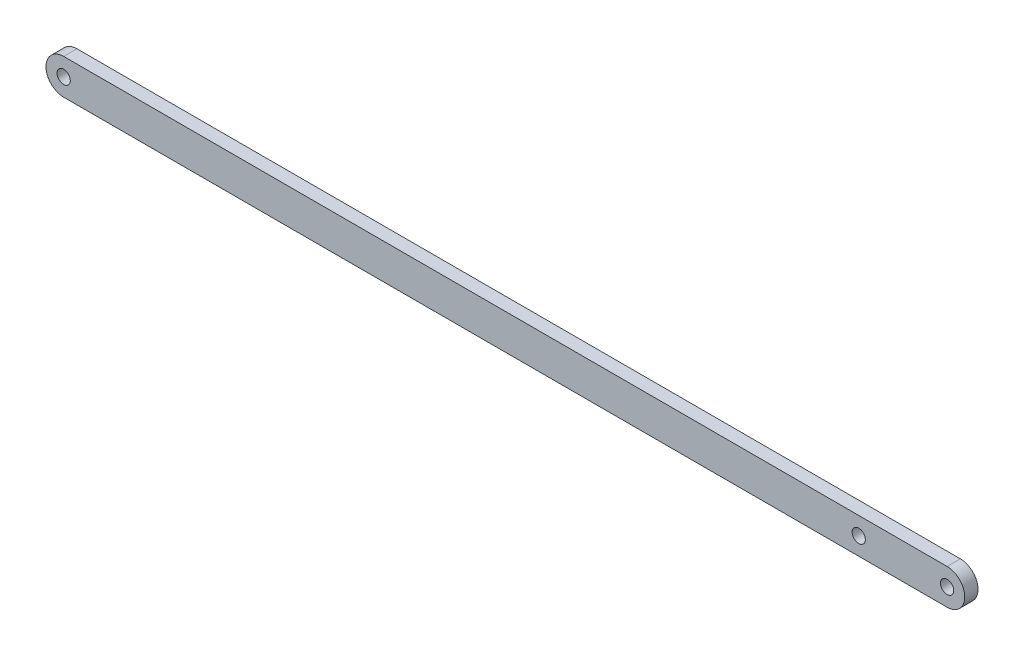
ISO-10303-21;
HEADER;
FILE_DESCRIPTION(('STEP AP214'),'2;1');
FILE_NAME('part.step','',(''),(''),'','','');
FILE_SCHEMA(('AUTOMOTIVE_DESIGN { 1 0 10303 214 1 1 1 1 }'));
ENDSEC;
DATA;
#1=APPLICATION_CONTEXT('core data for automotive mechanical design processes');
#2=APPLICATION_PROTOCOL_DEFINITION('international standard','automotive_design',2000,#1);
#3=PRODUCT_CONTEXT('',#1,'mechanical');
#4=PRODUCT('Part','Part','',(#3));
#5=PRODUCT_RELATED_PRODUCT_CATEGORY('part','',(#4));
#6=PRODUCT_DEFINITION_FORMATION('','',#4);
#7=PRODUCT_DEFINITION_CONTEXT('part definition',#1,'design');
#8=PRODUCT_DEFINITION('design','',#6,#7);
#9=PRODUCT_DEFINITION_SHAPE('','',#8);
#10=(LENGTH_UNIT() NAMED_UNIT(*) SI_UNIT(.MILLI.,.METRE.));
#11=(NAMED_UNIT(*) PLANE_ANGLE_UNIT() SI_UNIT($,.RADIAN.));
#12=(NAMED_UNIT(*) SI_UNIT($,.STERADIAN.) SOLID_ANGLE_UNIT());
#13=UNCERTAINTY_MEASURE_WITH_UNIT(LENGTH_MEASURE(1.E-05),#10,'distance_accuracy_value','');
#14=(GEOMETRIC_REPRESENTATION_CONTEXT(3) GLOBAL_UNCERTAINTY_ASSIGNED_CONTEXT((#13)) GLOBAL_UNIT_ASSIGNED_CONTEXT((#10,
#11,#12)) REPRESENTATION_CONTEXT('',''));
#15=CARTESIAN_POINT('',(0.,0.,0.));
#16=DIRECTION('',(0.,0.,1.));
#17=DIRECTION('',(1.,0.,0.));
#18=AXIS2_PLACEMENT_3D('',#15,#16,#17);
#19=CARTESIAN_POINT('',(-100.347124581452,0.,-4.5));
#20=DIRECTION('',(0.,0.,1.));
#21=DIRECTION('',(1.,0.,0.));
#22=AXIS2_PLACEMENT_3D('',#19,#20,#21);
#23=CYLINDRICAL_SURFACE('',#22,4.);
#24=CARTESIAN_POINT('',(-100.347124581452,0.,-1.5));
#25=DIRECTION('',(0.,0.,1.));
#26=DIRECTION('',(1.,0.,0.));
#27=AXIS2_PLACEMENT_3D('',#24,#25,#26);
#28=CIRCLE('',#27,4.);
#29=CARTESIAN_POINT('',(-100.347124581452,4.00000000000002,-1.5));
#30=VERTEX_POINT('',#29);
#31=CARTESIAN_POINT('',(-100.347124581452,-3.99999999999998,-1.5));
#32=VERTEX_POINT('',#31);
#33=EDGE_CURVE('E100',#30,#32,#28,.T.);
#34=ORIENTED_EDGE('',*,*,#33,.F.);
#35=DIRECTION('',(0.,0.,1.));
#36=VECTOR('',#35,1.);
#37=CARTESIAN_POINT('',(-100.347124581452,4.00000000000002,-4.5));
#38=LINE('',#37,#36);
#39=CARTESIAN_POINT('',(-100.347124581452,4.00000000000002,-4.5));
#40=VERTEX_POINT('',#39);
#41=EDGE_CURVE('E11',#40,#30,#38,.T.);
#42=ORIENTED_EDGE('',*,*,#41,.F.);
#43=CARTESIAN_POINT('',(-100.347124581452,0.,-4.5));
#44=DIRECTION('',(0.,0.,1.));
#45=DIRECTION('',(1.,0.,0.));
#46=AXIS2_PLACEMENT_3D('',#43,#44,#45);
#47=CIRCLE('',#46,4.);
#48=CARTESIAN_POINT('',(-100.347124581452,-3.99999999999998,-4.5));
#49=VERTEX_POINT('',#48);
#50=EDGE_CURVE('E93',#40,#49,#47,.T.);
#51=ORIENTED_EDGE('',*,*,#50,.T.);
#52=DIRECTION('',(0.,0.,1.));
#53=VECTOR('',#52,1.);
#54=CARTESIAN_POINT('',(-100.347124581452,-3.99999999999998,-4.5));
#55=LINE('',#54,#53);
#56=EDGE_CURVE('E38',#49,#32,#55,.T.);
#57=ORIENTED_EDGE('',*,*,#56,.T.);
#58=EDGE_LOOP('',(#34,#42,#51,#57));
#59=FACE_BOUND('',#58,.T.);
#60=ADVANCED_FACE('F35',(#59),#23,.T.);
#61=CARTESIAN_POINT('',(-100.347124581452,4.00000000000002,-4.5));
#62=DIRECTION('',(0.,1.,0.));
#63=DIRECTION('',(-1.,0.,0.));
#64=AXIS2_PLACEMENT_3D('',#61,#62,#63);
#65=PLANE('',#64);
#66=DIRECTION('',(-1.,0.,0.));
#67=VECTOR('',#66,1.);
#68=CARTESIAN_POINT('',(-100.347124581452,4.00000000000002,-1.5));
#69=LINE('',#68,#67);
#70=CARTESIAN_POINT('',(99.6528754185483,4.00000000000006,-1.5));
#71=VERTEX_POINT('',#70);
#72=EDGE_CURVE('E95',#71,#30,#69,.T.);
#73=ORIENTED_EDGE('',*,*,#72,.F.);
#74=DIRECTION('',(0.,0.,1.));
#75=VECTOR('',#74,1.);
#76=CARTESIAN_POINT('',(99.6528754185483,4.00000000000006,-4.5));
#77=LINE('',#76,#75);
#78=CARTESIAN_POINT('',(99.6528754185483,4.00000000000006,-4.5));
#79=VERTEX_POINT('',#78);
#80=EDGE_CURVE('E44',#79,#71,#77,.T.);
#81=ORIENTED_EDGE('',*,*,#80,.F.);
#82=DIRECTION('',(-1.,0.,0.));
#83=VECTOR('',#82,1.);
#84=CARTESIAN_POINT('',(-100.347124581452,4.00000000000002,-4.5));
#85=LINE('',#84,#83);
#86=EDGE_CURVE('E90',#79,#40,#85,.T.);
#87=ORIENTED_EDGE('',*,*,#86,.T.);
#88=ORIENTED_EDGE('',*,*,#41,.T.);
#89=EDGE_LOOP('',(#73,#81,#87,#88));
#90=FACE_BOUND('',#89,.T.);
#91=ADVANCED_FACE('F111',(#90),#65,.T.);
#92=CARTESIAN_POINT('',(99.6528754185483,0.,-4.5));
#93=DIRECTION('',(0.,0.,1.));
#94=DIRECTION('',(1.,0.,0.));
#95=AXIS2_PLACEMENT_3D('',#92,#93,#94);
#96=CYLINDRICAL_SURFACE('',#95,4.);
#97=CARTESIAN_POINT('',(99.6528754185483,0.,-1.5));
#98=DIRECTION('',(0.,0.,1.));
#99=DIRECTION('',(1.,0.,0.));
#100=AXIS2_PLACEMENT_3D('',#97,#98,#99);
#101=CIRCLE('',#100,4.);
#102=CARTESIAN_POINT('',(99.6528754185483,-3.99999999999995,-1.5));
#103=VERTEX_POINT('',#102);
#104=EDGE_CURVE('E85',#103,#71,#101,.T.);
#105=ORIENTED_EDGE('',*,*,#104,.F.);
#106=DIRECTION('',(0.,0.,1.));
#107=VECTOR('',#106,1.);
#108=CARTESIAN_POINT('',(99.6528754185483,-3.99999999999995,-4.5));
#109=LINE('',#108,#107);
#110=CARTESIAN_POINT('',(99.6528754185483,-3.99999999999995,-4.5));
#111=VERTEX_POINT('',#110);
#112=EDGE_CURVE('E80',#111,#103,#109,.T.);
#113=ORIENTED_EDGE('',*,*,#112,.F.);
#114=CARTESIAN_POINT('',(99.6528754185483,0.,-4.5));
#115=DIRECTION('',(0.,0.,1.));
#116=DIRECTION('',(1.,0.,0.));
#117=AXIS2_PLACEMENT_3D('',#114,#115,#116);
#118=CIRCLE('',#117,4.);
#119=EDGE_CURVE('E83',#111,#79,#118,.T.);
#120=ORIENTED_EDGE('',*,*,#119,.T.);
#121=ORIENTED_EDGE('',*,*,#80,.T.);
#122=EDGE_LOOP('',(#105,#113,#120,#121));
#123=FACE_BOUND('',#122,.T.);
#124=ADVANCED_FACE('F82',(#123),#96,.T.);
#125=CARTESIAN_POINT('',(-100.347124581452,-3.99999999999998,-4.5));
#126=DIRECTION('',(0.,-1.,0.));
#127=DIRECTION('',(1.,0.,0.));
#128=AXIS2_PLACEMENT_3D('',#125,#126,#127);
#129=PLANE('',#128);
#130=DIRECTION('',(1.,0.,0.));
#131=VECTOR('',#130,1.);
#132=CARTESIAN_POINT('',(-100.347124581452,-3.99999999999998,-1.5));
#133=LINE('',#132,#131);
#134=EDGE_CURVE('E103',#32,#103,#133,.T.);
#135=ORIENTED_EDGE('',*,*,#134,.F.);
#136=ORIENTED_EDGE('',*,*,#56,.F.);
#137=DIRECTION('',(1.,0.,0.));
#138=VECTOR('',#137,1.);
#139=CARTESIAN_POINT('',(-100.347124581452,-3.99999999999998,-4.5));
#140=LINE('',#139,#138);
#141=EDGE_CURVE('E89',#49,#111,#140,.T.);
#142=ORIENTED_EDGE('',*,*,#141,.T.);
#143=ORIENTED_EDGE('',*,*,#112,.T.);
#144=EDGE_LOOP('',(#135,#136,#142,#143));
#145=FACE_BOUND('',#144,.T.);
#146=ADVANCED_FACE('F92',(#145),#129,.T.);
#147=CARTESIAN_POINT('',(-100.347124581452,0.,-4.5));
#148=DIRECTION('',(0.,0.,1.));
#149=DIRECTION('',(1.,0.,0.));
#150=AXIS2_PLACEMENT_3D('',#147,#148,#149);
#151=PLANE('',#150);
#152=CARTESIAN_POINT('',(79.6528754185483,0.,-4.5));
#153=DIRECTION('',(0.,0.,1.));
#154=DIRECTION('',(1.,0.,0.));
#155=AXIS2_PLACEMENT_3D('',#152,#153,#154);
#156=CIRCLE('',#155,1.5);
#157=CARTESIAN_POINT('',(81.1528754185483,0.,-4.5));
#158=VERTEX_POINT('',#157);
#159=EDGE_CURVE('E148',#158,#158,#156,.T.);
#160=ORIENTED_EDGE('',*,*,#159,.T.);
#161=EDGE_LOOP('',(#160));
#162=FACE_BOUND('',#161,.T.);
#163=CARTESIAN_POINT('',(99.6528754185483,0.,-4.5));
#164=DIRECTION('',(0.,0.,1.));
#165=DIRECTION('',(1.,0.,0.));
#166=AXIS2_PLACEMENT_3D('',#163,#164,#165);
#167=CIRCLE('',#166,1.5);
#168=CARTESIAN_POINT('',(101.152875418548,0.,-4.5));
#169=VERTEX_POINT('',#168);
#170=EDGE_CURVE('E156',#169,#169,#167,.T.);
#171=ORIENTED_EDGE('',*,*,#170,.T.);
#172=EDGE_LOOP('',(#171));
#173=FACE_BOUND('',#172,.T.);
#174=CARTESIAN_POINT('',(-100.347124581452,0.,-4.5));
#175=DIRECTION('',(0.,0.,1.));
#176=DIRECTION('',(1.,0.,0.));
#177=AXIS2_PLACEMENT_3D('',#174,#175,#176);
#178=CIRCLE('',#177,1.5);
#179=CARTESIAN_POINT('',(-98.8471245814517,0.,-4.5));
#180=VERTEX_POINT('',#179);
#181=EDGE_CURVE('E104',#180,#180,#178,.T.);
#182=ORIENTED_EDGE('',*,*,#181,.T.);
#183=EDGE_LOOP('',(#182));
#184=FACE_BOUND('',#183,.T.);
#185=ORIENTED_EDGE('',*,*,#50,.F.);
#186=ORIENTED_EDGE('',*,*,#86,.F.);
#187=ORIENTED_EDGE('',*,*,#119,.F.);
#188=ORIENTED_EDGE('',*,*,#141,.F.);
#189=EDGE_LOOP('',(#185,#186,#187,#188));
#190=FACE_BOUND('',#189,.T.);
#191=ADVANCED_FACE('F88',(#162,#173,#184,#190),#151,.F.);
#192=CARTESIAN_POINT('',(-100.347124581452,0.,-1.5));
#193=DIRECTION('',(0.,0.,1.));
#194=DIRECTION('',(1.,0.,0.));
#195=AXIS2_PLACEMENT_3D('',#192,#193,#194);
#196=PLANE('',#195);
#197=CARTESIAN_POINT('',(79.6528754185483,0.,-1.5));
#198=DIRECTION('',(0.,0.,1.));
#199=DIRECTION('',(1.,0.,0.));
#200=AXIS2_PLACEMENT_3D('',#197,#198,#199);
#201=CIRCLE('',#200,1.5);
#202=CARTESIAN_POINT('',(81.1528754185483,0.,-1.5));
#203=VERTEX_POINT('',#202);
#204=EDGE_CURVE('E151',#203,#203,#201,.T.);
#205=ORIENTED_EDGE('',*,*,#204,.F.);
#206=EDGE_LOOP('',(#205));
#207=FACE_BOUND('',#206,.T.);
#208=CARTESIAN_POINT('',(99.6528754185483,0.,-1.5));
#209=DIRECTION('',(0.,0.,1.));
#210=DIRECTION('',(1.,0.,0.));
#211=AXIS2_PLACEMENT_3D('',#208,#209,#210);
#212=CIRCLE('',#211,1.5);
#213=CARTESIAN_POINT('',(101.152875418548,0.,-1.5));
#214=VERTEX_POINT('',#213);
#215=EDGE_CURVE('E153',#214,#214,#212,.T.);
#216=ORIENTED_EDGE('',*,*,#215,.F.);
#217=EDGE_LOOP('',(#216));
#218=FACE_BOUND('',#217,.T.);
#219=CARTESIAN_POINT('',(-100.347124581452,0.,-1.5));
#220=DIRECTION('',(0.,0.,1.));
#221=DIRECTION('',(1.,0.,0.));
#222=AXIS2_PLACEMENT_3D('',#219,#220,#221);
#223=CIRCLE('',#222,1.5);
#224=CARTESIAN_POINT('',(-98.8471245814517,0.,-1.5));
#225=VERTEX_POINT('',#224);
#226=EDGE_CURVE('E159',#225,#225,#223,.T.);
#227=ORIENTED_EDGE('',*,*,#226,.F.);
#228=EDGE_LOOP('',(#227));
#229=FACE_BOUND('',#228,.T.);
#230=ORIENTED_EDGE('',*,*,#33,.T.);
#231=ORIENTED_EDGE('',*,*,#134,.T.);
#232=ORIENTED_EDGE('',*,*,#104,.T.);
#233=ORIENTED_EDGE('',*,*,#72,.T.);
#234=EDGE_LOOP('',(#230,#231,#232,#233));
#235=FACE_BOUND('',#234,.T.);
#236=ADVANCED_FACE('F110',(#207,#218,#229,#235),#196,.T.);
#237=CARTESIAN_POINT('',(-100.347124581452,0.,-4.5));
#238=DIRECTION('',(0.,0.,1.));
#239=DIRECTION('',(1.,0.,0.));
#240=AXIS2_PLACEMENT_3D('',#237,#238,#239);
#241=CYLINDRICAL_SURFACE('',#240,1.5);
#242=ORIENTED_EDGE('',*,*,#181,.F.);
#243=EDGE_LOOP('',(#242));
#244=FACE_BOUND('',#243,.T.);
#245=ORIENTED_EDGE('',*,*,#226,.T.);
#246=EDGE_LOOP('',(#245));
#247=FACE_BOUND('',#246,.T.);
#248=ADVANCED_FACE('F129',(#244,#247),#241,.F.);
#249=CARTESIAN_POINT('',(99.6528754185483,0.,-4.5));
#250=DIRECTION('',(0.,0.,1.));
#251=DIRECTION('',(1.,0.,0.));
#252=AXIS2_PLACEMENT_3D('',#249,#250,#251);
#253=CYLINDRICAL_SURFACE('',#252,1.5);
#254=ORIENTED_EDGE('',*,*,#170,.F.);
#255=EDGE_LOOP('',(#254));
#256=FACE_BOUND('',#255,.T.);
#257=ORIENTED_EDGE('',*,*,#215,.T.);
#258=EDGE_LOOP('',(#257));
#259=FACE_BOUND('',#258,.T.);
#260=ADVANCED_FACE('F136',(#256,#259),#253,.F.);
#261=CARTESIAN_POINT('',(79.6528754185483,0.,-4.5));
#262=DIRECTION('',(0.,0.,1.));
#263=DIRECTION('',(1.,0.,0.));
#264=AXIS2_PLACEMENT_3D('',#261,#262,#263);
#265=CYLINDRICAL_SURFACE('',#264,1.5);
#266=ORIENTED_EDGE('',*,*,#159,.F.);
#267=EDGE_LOOP('',(#266));
#268=FACE_BOUND('',#267,.T.);
#269=ORIENTED_EDGE('',*,*,#204,.T.);
#270=EDGE_LOOP('',(#269));
#271=FACE_BOUND('',#270,.T.);
#272=ADVANCED_FACE('F140',(#268,#271),#265,.F.);
#273=CLOSED_SHELL('',(#60,#91,#124,#146,#191,#236,#248,#260,#272));
#274=MANIFOLD_SOLID_BREP('B2',#273);
#275=ADVANCED_BREP_SHAPE_REPRESENTATION('',(#18,#274),#14);
#276=SHAPE_DEFINITION_REPRESENTATION(#9,#275);
ENDSEC;
END-ISO-10303-21;
